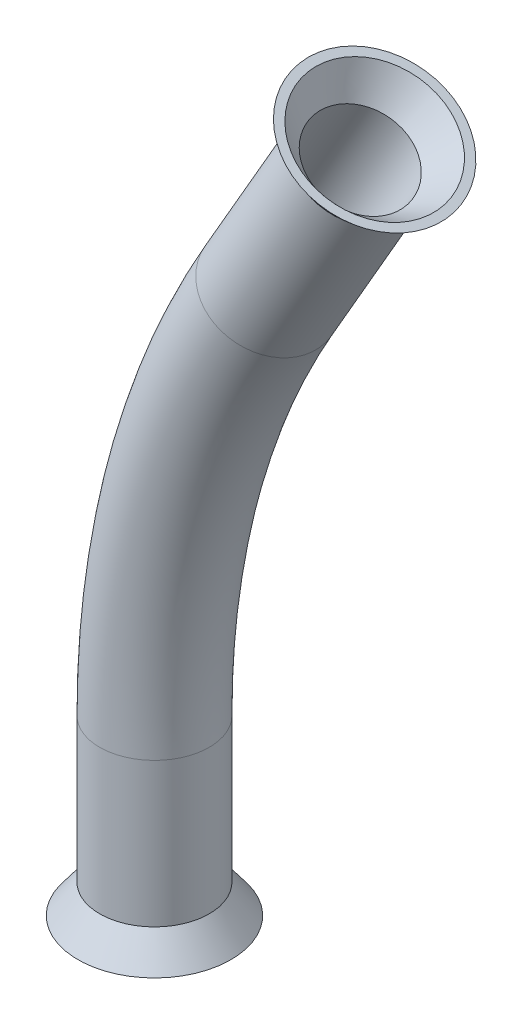
ISO-10303-21;
HEADER;
FILE_DESCRIPTION(('STEP AP214'),'2;1');
FILE_NAME('part.step','',(''),(''),'','','');
FILE_SCHEMA(('AUTOMOTIVE_DESIGN { 1 0 10303 214 1 1 1 1 }'));
ENDSEC;
DATA;
#1=APPLICATION_CONTEXT('core data for automotive mechanical design processes');
#2=APPLICATION_PROTOCOL_DEFINITION('international standard','automotive_design',2000,#1);
#3=PRODUCT_CONTEXT('',#1,'mechanical');
#4=PRODUCT('Part','Part','',(#3));
#5=PRODUCT_RELATED_PRODUCT_CATEGORY('part','',(#4));
#6=PRODUCT_DEFINITION_FORMATION('','',#4);
#7=PRODUCT_DEFINITION_CONTEXT('part definition',#1,'design');
#8=PRODUCT_DEFINITION('design','',#6,#7);
#9=PRODUCT_DEFINITION_SHAPE('','',#8);
#10=(LENGTH_UNIT() NAMED_UNIT(*) SI_UNIT(.MILLI.,.METRE.));
#11=(NAMED_UNIT(*) PLANE_ANGLE_UNIT() SI_UNIT($,.RADIAN.));
#12=(NAMED_UNIT(*) SI_UNIT($,.STERADIAN.) SOLID_ANGLE_UNIT());
#13=UNCERTAINTY_MEASURE_WITH_UNIT(LENGTH_MEASURE(1.E-05),#10,'distance_accuracy_value','');
#14=(GEOMETRIC_REPRESENTATION_CONTEXT(3) GLOBAL_UNCERTAINTY_ASSIGNED_CONTEXT((#13)) GLOBAL_UNIT_ASSIGNED_CONTEXT((#10,
#11,#12)) REPRESENTATION_CONTEXT('',''));
#15=CARTESIAN_POINT('',(0.,0.,0.));
#16=DIRECTION('',(0.,0.,1.));
#17=DIRECTION('',(1.,0.,0.));
#18=AXIS2_PLACEMENT_3D('',#15,#16,#17);
#19=CARTESIAN_POINT('',(0.,0.,0.));
#20=DIRECTION('',(0.,1.,0.));
#21=DIRECTION('',(0.,0.,1.));
#22=AXIS2_PLACEMENT_3D('',#19,#20,#21);
#23=CYLINDRICAL_SURFACE('',#22,4.826);
#24=CARTESIAN_POINT('',(0.,12.7,0.));
#25=DIRECTION('',(0.,1.,0.));
#26=DIRECTION('',(0.,0.,1.));
#27=AXIS2_PLACEMENT_3D('',#24,#25,#26);
#28=CIRCLE('',#27,4.826);
#29=CARTESIAN_POINT('',(-4.82599999999998,12.7,0.));
#30=VERTEX_POINT('',#29);
#31=EDGE_CURVE('E58',#30,#30,#28,.T.);
#32=ORIENTED_EDGE('',*,*,#31,.F.);
#33=EDGE_LOOP('',(#32));
#34=FACE_BOUND('',#33,.T.);
#35=CARTESIAN_POINT('',(0.,0.,0.));
#36=DIRECTION('',(0.,-1.,0.));
#37=DIRECTION('',(0.,0.,-1.));
#38=AXIS2_PLACEMENT_3D('',#35,#36,#37);
#39=CIRCLE('',#38,4.826);
#40=CARTESIAN_POINT('',(0.,0.,-4.826));
#41=VERTEX_POINT('',#40);
#42=EDGE_CURVE('E68',#41,#41,#39,.T.);
#43=ORIENTED_EDGE('',*,*,#42,.F.);
#44=EDGE_LOOP('',(#43));
#45=FACE_BOUND('',#44,.T.);
#46=ADVANCED_FACE('F37',(#34,#45),#23,.T.);
#47=CARTESIAN_POINT('',(74.8128939111738,12.7,0.));
#48=DIRECTION('',(0.,0.,-1.));
#49=DIRECTION('',(-1.,0.,0.));
#50=AXIS2_PLACEMENT_3D('',#47,#48,#49);
#51=TOROIDAL_SURFACE('',#50,74.8128939111738,4.826);
#52=CARTESIAN_POINT('',(10.0230272534672,50.106446955587,0.));
#53=DIRECTION('',(0.500000000000001,0.866025403784438,0.));
#54=DIRECTION('',(0.,0.,1.));
#55=AXIS2_PLACEMENT_3D('',#52,#53,#54);
#56=CIRCLE('',#55,4.826);
#57=CARTESIAN_POINT('',(5.8435886548035,52.519446955587,0.));
#58=VERTEX_POINT('',#57);
#59=EDGE_CURVE('E41',#58,#58,#56,.T.);
#60=CARTESIAN_POINT('',(74.8128939111738,12.7,0.));
#61=DIRECTION('',(0.,0.,-1.));
#62=DIRECTION('',(-1.,0.,0.));
#63=AXIS2_PLACEMENT_3D('',#60,#61,#62);
#64=CIRCLE('',#63,79.6388939111739);
#65=EDGE_CURVE('',#30,#58,#64,.T.);
#66=ORIENTED_EDGE('',*,*,#31,.T.);
#67=ORIENTED_EDGE('',*,*,#59,.F.);
#68=ORIENTED_EDGE('',*,*,#65,.T.);
#69=ORIENTED_EDGE('',*,*,#65,.F.);
#70=EDGE_LOOP('',(#66,#68,#67,#69));
#71=FACE_BOUND('',#70,.T.);
#72=ADVANCED_FACE('F115',(#71),#51,.T.);
#73=CARTESIAN_POINT('',(10.0230272534672,50.106446955587,0.));
#74=DIRECTION('',(0.500000000000001,0.866025403784438,0.));
#75=DIRECTION('',(-0.866025403784438,0.500000000000001,0.));
#76=AXIS2_PLACEMENT_3D('',#73,#74,#75);
#77=CYLINDRICAL_SURFACE('',#76,4.826);
#78=CARTESIAN_POINT('',(18.12241613,64.135,0.));
#79=DIRECTION('',(0.500000000000001,0.866025403784438,0.));
#80=DIRECTION('',(0.,0.,1.));
#81=AXIS2_PLACEMENT_3D('',#78,#79,#80);
#82=CIRCLE('',#81,4.826);
#83=CARTESIAN_POINT('',(18.12241613,64.135,4.826));
#84=VERTEX_POINT('',#83);
#85=EDGE_CURVE('E52',#84,#84,#82,.T.);
#86=ORIENTED_EDGE('',*,*,#85,.F.);
#87=EDGE_LOOP('',(#86));
#88=FACE_BOUND('',#87,.T.);
#89=ORIENTED_EDGE('',*,*,#59,.T.);
#90=EDGE_LOOP('',(#89));
#91=FACE_BOUND('',#90,.T.);
#92=ADVANCED_FACE('F39',(#88,#91),#77,.T.);
#93=CARTESIAN_POINT('',(0.,0.,0.));
#94=DIRECTION('',(0.,1.,0.));
#95=DIRECTION('',(0.,0.,1.));
#96=AXIS2_PLACEMENT_3D('',#93,#94,#95);
#97=CYLINDRICAL_SURFACE('',#96,4.064);
#98=CARTESIAN_POINT('',(0.,12.7,0.));
#99=DIRECTION('',(0.,1.,0.));
#100=DIRECTION('',(0.,0.,1.));
#101=AXIS2_PLACEMENT_3D('',#98,#99,#100);
#102=CIRCLE('',#101,4.064);
#103=CARTESIAN_POINT('',(-4.06399999999998,12.7,0.));
#104=VERTEX_POINT('',#103);
#105=EDGE_CURVE('E46',#104,#104,#102,.F.);
#106=ORIENTED_EDGE('',*,*,#105,.F.);
#107=EDGE_LOOP('',(#106));
#108=FACE_BOUND('',#107,.T.);
#109=CARTESIAN_POINT('',(0.,0.,0.));
#110=DIRECTION('',(0.,-1.,0.));
#111=DIRECTION('',(0.,0.,-1.));
#112=AXIS2_PLACEMENT_3D('',#109,#110,#111);
#113=CIRCLE('',#112,4.064);
#114=CARTESIAN_POINT('',(0.,0.,-4.064));
#115=VERTEX_POINT('',#114);
#116=EDGE_CURVE('E73',#115,#115,#113,.T.);
#117=ORIENTED_EDGE('',*,*,#116,.T.);
#118=EDGE_LOOP('',(#117));
#119=FACE_BOUND('',#118,.T.);
#120=ADVANCED_FACE('F114',(#108,#119),#97,.F.);
#121=CARTESIAN_POINT('',(74.8128939111738,12.7,0.));
#122=DIRECTION('',(0.,0.,-1.));
#123=DIRECTION('',(-1.,0.,0.));
#124=AXIS2_PLACEMENT_3D('',#121,#122,#123);
#125=TOROIDAL_SURFACE('',#124,74.8128939111738,4.064);
#126=CARTESIAN_POINT('',(10.0230272534672,50.106446955587,0.));
#127=DIRECTION('',(0.500000000000001,0.866025403784438,0.));
#128=DIRECTION('',(0.,0.,1.));
#129=AXIS2_PLACEMENT_3D('',#126,#127,#128);
#130=CIRCLE('',#129,4.064);
#131=CARTESIAN_POINT('',(6.50350001248724,52.138446955587,0.));
#132=VERTEX_POINT('',#131);
#133=EDGE_CURVE('E10',#132,#132,#130,.F.);
#134=CARTESIAN_POINT('',(74.8128939111738,12.7,0.));
#135=DIRECTION('',(0.,0.,-1.));
#136=DIRECTION('',(-1.,0.,0.));
#137=AXIS2_PLACEMENT_3D('',#134,#135,#136);
#138=CIRCLE('',#137,78.8768939111739);
#139=EDGE_CURVE('',#104,#132,#138,.T.);
#140=ORIENTED_EDGE('',*,*,#105,.T.);
#141=ORIENTED_EDGE('',*,*,#133,.F.);
#142=ORIENTED_EDGE('',*,*,#139,.T.);
#143=ORIENTED_EDGE('',*,*,#139,.F.);
#144=EDGE_LOOP('',(#140,#142,#141,#143));
#145=FACE_BOUND('',#144,.T.);
#146=ADVANCED_FACE('F127',(#145),#125,.F.);
#147=CARTESIAN_POINT('',(10.0230272534672,50.106446955587,0.));
#148=DIRECTION('',(0.500000000000001,0.866025403784438,0.));
#149=DIRECTION('',(-0.866025403784438,0.500000000000001,0.));
#150=AXIS2_PLACEMENT_3D('',#147,#148,#149);
#151=CYLINDRICAL_SURFACE('',#150,4.064);
#152=CARTESIAN_POINT('',(18.12241613,64.135,0.));
#153=DIRECTION('',(0.500000000000001,0.866025403784438,0.));
#154=DIRECTION('',(-0.866025403784438,0.500000000000001,0.));
#155=AXIS2_PLACEMENT_3D('',#152,#153,#154);
#156=CIRCLE('',#155,4.06399999999996);
#157=CARTESIAN_POINT('',(14.6028888890201,66.167,0.));
#158=VERTEX_POINT('',#157);
#159=EDGE_CURVE('E87',#158,#158,#156,.T.);
#160=ORIENTED_EDGE('',*,*,#159,.T.);
#161=EDGE_LOOP('',(#160));
#162=FACE_BOUND('',#161,.T.);
#163=ORIENTED_EDGE('',*,*,#133,.T.);
#164=EDGE_LOOP('',(#163));
#165=FACE_BOUND('',#164,.T.);
#166=ADVANCED_FACE('F125',(#162,#165),#151,.F.);
#167=CARTESIAN_POINT('',(0.,0.,0.));
#168=DIRECTION('',(0.,-1.,0.));
#169=DIRECTION('',(0.,0.,-1.));
#170=AXIS2_PLACEMENT_3D('',#167,#168,#169);
#171=CONICAL_SURFACE('',#170,4.826,0.645771823237903);
#172=CARTESIAN_POINT('',(0.,-2.54,0.));
#173=DIRECTION('',(0.,-1.,0.));
#174=DIRECTION('',(0.,0.,-1.));
#175=AXIS2_PLACEMENT_3D('',#172,#173,#174);
#176=CIRCLE('',#175,6.7400272872611);
#177=CARTESIAN_POINT('',(0.,-2.54,-6.7400272872611));
#178=VERTEX_POINT('',#177);
#179=EDGE_CURVE('E61',#178,#178,#176,.T.);
#180=ORIENTED_EDGE('',*,*,#179,.F.);
#181=EDGE_LOOP('',(#180));
#182=FACE_BOUND('',#181,.T.);
#183=ORIENTED_EDGE('',*,*,#42,.T.);
#184=EDGE_LOOP('',(#183));
#185=FACE_BOUND('',#184,.T.);
#186=ADVANCED_FACE('F124',(#182,#185),#171,.T.);
#187=CARTESIAN_POINT('',(0.,-2.54,0.));
#188=DIRECTION('',(0.,-1.,0.));
#189=DIRECTION('',(0.,0.,-1.));
#190=AXIS2_PLACEMENT_3D('',#187,#188,#189);
#191=PLANE('',#190);
#192=CARTESIAN_POINT('',(0.,-2.54,0.));
#193=DIRECTION('',(0.,-1.,0.));
#194=DIRECTION('',(0.,0.,-1.));
#195=AXIS2_PLACEMENT_3D('',#192,#193,#194);
#196=CIRCLE('',#195,5.9780272872611);
#197=CARTESIAN_POINT('',(0.,-2.54,-5.9780272872611));
#198=VERTEX_POINT('',#197);
#199=EDGE_CURVE('E79',#198,#198,#196,.T.);
#200=ORIENTED_EDGE('',*,*,#199,.F.);
#201=EDGE_LOOP('',(#200));
#202=FACE_BOUND('',#201,.T.);
#203=ORIENTED_EDGE('',*,*,#179,.T.);
#204=EDGE_LOOP('',(#203));
#205=FACE_BOUND('',#204,.T.);
#206=ADVANCED_FACE('F134',(#202,#205),#191,.T.);
#207=CARTESIAN_POINT('',(0.,-2.54,0.));
#208=DIRECTION('',(0.,-1.,0.));
#209=DIRECTION('',(0.,0.,-1.));
#210=AXIS2_PLACEMENT_3D('',#207,#208,#209);
#211=CONICAL_SURFACE('',#210,5.9780272872611,0.645771823237903);
#212=ORIENTED_EDGE('',*,*,#199,.T.);
#213=EDGE_LOOP('',(#212));
#214=FACE_BOUND('',#213,.T.);
#215=ORIENTED_EDGE('',*,*,#116,.F.);
#216=EDGE_LOOP('',(#215));
#217=FACE_BOUND('',#216,.T.);
#218=ADVANCED_FACE('F108',(#214,#217),#211,.F.);
#219=CARTESIAN_POINT('',(18.12241613,64.135,0.));
#220=DIRECTION('',(0.500000000000001,0.866025403784438,0.));
#221=DIRECTION('',(-0.866025403784438,0.500000000000001,0.));
#222=AXIS2_PLACEMENT_3D('',#219,#220,#221);
#223=CONICAL_SURFACE('',#222,4.826,0.645771823237903);
#224=CARTESIAN_POINT('',(19.39241613,66.3347045256125,0.));
#225=DIRECTION('',(0.500000000000001,0.866025403784438,0.));
#226=DIRECTION('',(-0.866025403784438,0.500000000000001,0.));
#227=AXIS2_PLACEMENT_3D('',#224,#225,#226);
#228=CIRCLE('',#227,6.7400272872611);
#229=CARTESIAN_POINT('',(13.5553812770316,69.7047181692431,0.));
#230=VERTEX_POINT('',#229);
#231=EDGE_CURVE('E83',#230,#230,#228,.T.);
#232=ORIENTED_EDGE('',*,*,#231,.F.);
#233=EDGE_LOOP('',(#232));
#234=FACE_BOUND('',#233,.T.);
#235=ORIENTED_EDGE('',*,*,#85,.T.);
#236=EDGE_LOOP('',(#235));
#237=FACE_BOUND('',#236,.T.);
#238=ADVANCED_FACE('F102',(#234,#237),#223,.T.);
#239=CARTESIAN_POINT('',(19.39241613,66.3347045256125,0.));
#240=DIRECTION('',(0.500000000000001,0.866025403784438,0.));
#241=DIRECTION('',(-0.866025403784438,0.500000000000001,0.));
#242=AXIS2_PLACEMENT_3D('',#239,#240,#241);
#243=PLANE('',#242);
#244=CARTESIAN_POINT('',(19.39241613,66.3347045256126,0.));
#245=DIRECTION('',(0.500000000000001,0.866025403784438,0.));
#246=DIRECTION('',(-0.866025403784438,0.500000000000001,0.));
#247=AXIS2_PLACEMENT_3D('',#244,#245,#246);
#248=CIRCLE('',#247,5.97802728726111);
#249=CARTESIAN_POINT('',(14.2152926347154,69.3237181692431,0.));
#250=VERTEX_POINT('',#249);
#251=EDGE_CURVE('E91',#250,#250,#248,.T.);
#252=ORIENTED_EDGE('',*,*,#251,.F.);
#253=EDGE_LOOP('',(#252));
#254=FACE_BOUND('',#253,.T.);
#255=ORIENTED_EDGE('',*,*,#231,.T.);
#256=EDGE_LOOP('',(#255));
#257=FACE_BOUND('',#256,.T.);
#258=ADVANCED_FACE('F99',(#254,#257),#243,.T.);
#259=CARTESIAN_POINT('',(19.39241613,66.3347045256126,0.));
#260=DIRECTION('',(0.500000000000001,0.866025403784438,0.));
#261=DIRECTION('',(-0.866025403784438,0.500000000000001,0.));
#262=AXIS2_PLACEMENT_3D('',#259,#260,#261);
#263=CONICAL_SURFACE('',#262,5.97802728726111,0.645771823237903);
#264=CARTESIAN_POINT('',(14.2152926347154,69.3237181692431,0.));
#265=CARTESIAN_POINT('',(14.2193300956977,69.2908356883135,0.));
#266=CARTESIAN_POINT('',(14.22336755668,69.2579532073839,0.));
#267=CARTESIAN_POINT('',(14.2314424786447,69.1921882455247,0.));
#268=CARTESIAN_POINT('',(14.2354799396271,69.159305764595,0.));
#269=CARTESIAN_POINT('',(14.2435548615917,69.0935408027358,0.));
#270=CARTESIAN_POINT('',(14.2475923225741,69.0606583218062,0.));
#271=CARTESIAN_POINT('',(14.2556672445388,68.994893359947,0.));
#272=CARTESIAN_POINT('',(14.2597047055211,68.9620108790174,0.));
#273=CARTESIAN_POINT('',(14.2677796274858,68.8962459171581,0.));
#274=CARTESIAN_POINT('',(14.2718170884681,68.8633634362285,0.));
#275=CARTESIAN_POINT('',(14.2798920104328,68.7975984743693,0.));
#276=CARTESIAN_POINT('',(14.2839294714151,68.7647159934397,0.));
#277=CARTESIAN_POINT('',(14.2920043933798,68.6989510315804,0.));
#278=CARTESIAN_POINT('',(14.2960418543622,68.6660685506508,0.));
#279=CARTESIAN_POINT('',(14.3041167763269,68.6003035887916,0.));
#280=CARTESIAN_POINT('',(14.3081542373092,68.567421107862,0.));
#281=CARTESIAN_POINT('',(14.3162291592739,68.5016561460027,0.));
#282=CARTESIAN_POINT('',(14.3202666202562,68.4687736650731,0.));
#283=CARTESIAN_POINT('',(14.3283415422209,68.4030087032139,0.));
#284=CARTESIAN_POINT('',(14.3323790032032,68.3701262222843,0.));
#285=CARTESIAN_POINT('',(14.3404539251679,68.3043612604251,0.));
#286=CARTESIAN_POINT('',(14.3444913861503,68.2714787794954,0.));
#287=CARTESIAN_POINT('',(14.3525663081149,68.2057138176362,0.));
#288=CARTESIAN_POINT('',(14.3566037690973,68.1728313367066,0.));
#289=CARTESIAN_POINT('',(14.364678691062,68.1070663748474,0.));
#290=CARTESIAN_POINT('',(14.3687161520443,68.0741838939177,0.));
#291=CARTESIAN_POINT('',(14.376791074009,68.0084189320585,0.));
#292=CARTESIAN_POINT('',(14.3808285349913,67.9755364511289,0.));
#293=CARTESIAN_POINT('',(14.388903456956,67.9097714892697,0.));
#294=CARTESIAN_POINT('',(14.3929409179384,67.87688900834,0.));
#295=CARTESIAN_POINT('',(14.401015839903,67.8111240464808,0.));
#296=CARTESIAN_POINT('',(14.4050533008854,67.7782415655512,0.));
#297=CARTESIAN_POINT('',(14.4131282228501,67.712476603692,0.));
#298=CARTESIAN_POINT('',(14.4171656838324,67.6795941227624,0.));
#299=CARTESIAN_POINT('',(14.4252406057971,67.6138291609031,0.));
#300=CARTESIAN_POINT('',(14.4292780667794,67.5809466799735,0.));
#301=CARTESIAN_POINT('',(14.4373529887441,67.5151817181143,0.));
#302=CARTESIAN_POINT('',(14.4413904497264,67.4822992371847,0.));
#303=CARTESIAN_POINT('',(14.4494653716911,67.4165342753254,0.));
#304=CARTESIAN_POINT('',(14.4535028326735,67.3836517943958,0.));
#305=CARTESIAN_POINT('',(14.4615777546382,67.3178868325366,0.));
#306=CARTESIAN_POINT('',(14.4656152156205,67.285004351607,0.));
#307=CARTESIAN_POINT('',(14.4736901375852,67.2192393897477,0.));
#308=CARTESIAN_POINT('',(14.4777275985675,67.1863569088181,0.));
#309=CARTESIAN_POINT('',(14.4858025205322,67.1205919469589,0.));
#310=CARTESIAN_POINT('',(14.4898399815145,67.0877094660293,0.));
#311=CARTESIAN_POINT('',(14.4979149034792,67.0219445041701,0.));
#312=CARTESIAN_POINT('',(14.5019523644616,66.9890620232404,0.));
#313=CARTESIAN_POINT('',(14.5100272864262,66.9232970613812,0.));
#314=CARTESIAN_POINT('',(14.5140647474086,66.8904145804516,0.));
#315=CARTESIAN_POINT('',(14.5221396693733,66.8246496185923,0.));
#316=CARTESIAN_POINT('',(14.5261771303556,66.7917671376627,0.));
#317=CARTESIAN_POINT('',(14.5342520523203,66.7260021758035,0.));
#318=CARTESIAN_POINT('',(14.5382895133026,66.6931196948739,0.));
#319=CARTESIAN_POINT('',(14.5463644352673,66.6273547330147,0.));
#320=CARTESIAN_POINT('',(14.5504018962497,66.5944722520851,0.));
#321=CARTESIAN_POINT('',(14.5584768182143,66.5287072902258,0.));
#322=CARTESIAN_POINT('',(14.5625142791967,66.4958248092962,0.));
#323=CARTESIAN_POINT('',(14.5705892011614,66.430059847437,0.));
#324=CARTESIAN_POINT('',(14.5746266621437,66.3971773665073,0.));
#325=CARTESIAN_POINT('',(14.5827015841084,66.3314124046481,0.));
#326=CARTESIAN_POINT('',(14.5867390450907,66.2985299237185,0.));
#327=CARTESIAN_POINT('',(14.5948139670554,66.2327649618593,0.));
#328=CARTESIAN_POINT('',(14.5988514280377,66.1998824809296,0.));
#329=CARTESIAN_POINT('',(14.6028888890201,66.167,0.));
#330=B_SPLINE_CURVE_WITH_KNOTS('',3,(#264,#265,#266,#267,#268,#269,#270,#271,#272,#273,#274,
#275,#276,#277,#278,#279,#280,#281,#282,#283,#284,#285,#286,#287,#288,#289,#290,#291,#292,#293,
#294,#295,#296,#297,#298,#299,#300,#301,#302,#303,#304,#305,#306,#307,#308,#309,#310,#311,#312,
#313,#314,#315,#316,#317,#318,#319,#320,#321,#322,#323,#324,#325,#326,#327,#328,#329),
.UNSPECIFIED.,.F.,.F.,(4,2,2,2,2,2,2,2,2,2,2,2,2,2,2,2,2,2,2,2,2,2,2,2,2,2,2,2,2,2,2,2,4),(0.,
0.0993882678661606,0.198776535732321,0.298164803598468,0.397553071464628,0.496941339330761,
0.596329607196921,0.695717875063068,0.795106142929228,0.894494410795389,0.993882678661535,
1.0932709465277,1.19265921439383,1.29204748225999,1.39143575012614,1.4908240179923,
1.59021228585844,1.6896005537246,1.78898882159076,1.8883770894569,1.98776535732306,
2.0871536251892,2.18654189305536,2.28593016092151,2.38531842878767,2.48470669665383,
2.58409496451996,2.68348323238612,2.78287150025227,2.88225976811843,2.98164803598458,
3.08103630385074,3.1804245717169),.UNSPECIFIED.);
#331=EDGE_CURVE('BSEAM96',#250,#158,#330,.T.);
#332=ORIENTED_EDGE('',*,*,#251,.T.);
#333=ORIENTED_EDGE('',*,*,#159,.F.);
#334=ORIENTED_EDGE('',*,*,#331,.T.);
#335=ORIENTED_EDGE('',*,*,#331,.F.);
#336=EDGE_LOOP('',(#332,#334,#333,#335));
#337=FACE_BOUND('',#336,.T.);
#338=ADVANCED_FACE('F96',(#337),#263,.F.);
#339=CLOSED_SHELL('',(#46,#72,#92,#120,#146,#166,#186,#206,#218,#238,#258,#338));
#340=MANIFOLD_SOLID_BREP('B2',#339);
#341=ADVANCED_BREP_SHAPE_REPRESENTATION('',(#18,#340),#14);
#342=SHAPE_DEFINITION_REPRESENTATION(#9,#341);
ENDSEC;
END-ISO-10303-21;
